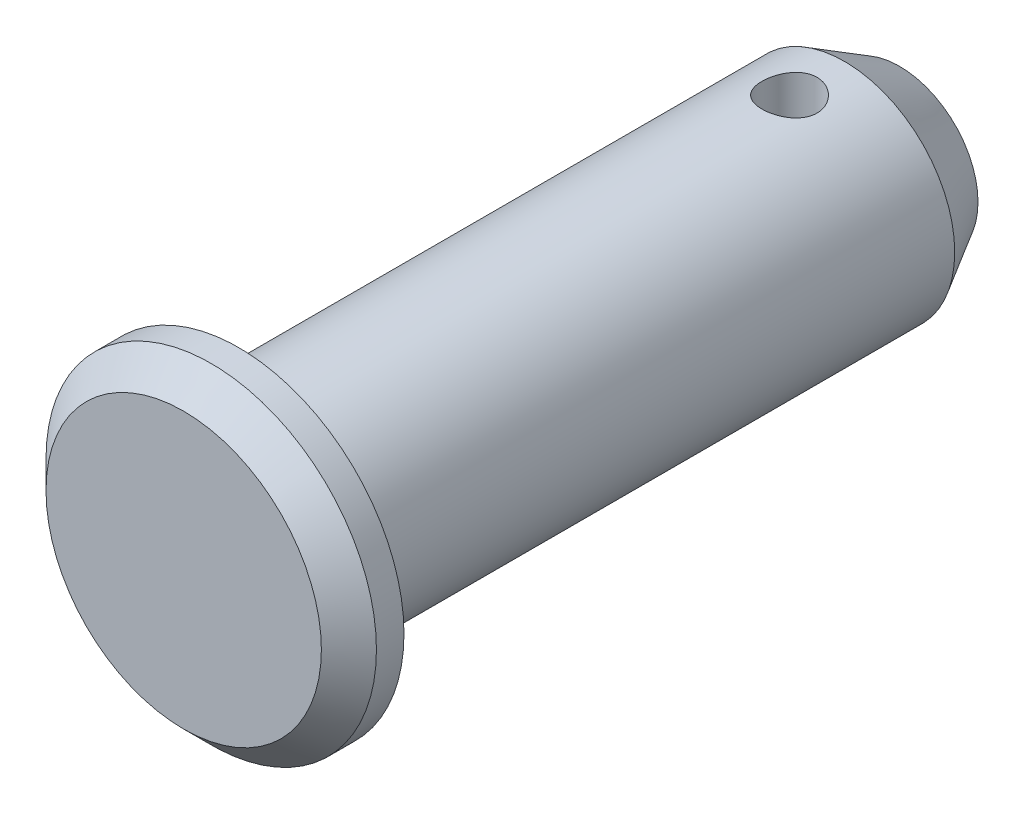
ISO-10303-21;
HEADER;
FILE_DESCRIPTION(('STEP AP214'),'2;1');
FILE_NAME('part.step','',(''),(''),'','','');
FILE_SCHEMA(('AUTOMOTIVE_DESIGN { 1 0 10303 214 1 1 1 1 }'));
ENDSEC;
DATA;
#1=APPLICATION_CONTEXT('core data for automotive mechanical design processes');
#2=APPLICATION_PROTOCOL_DEFINITION('international standard','automotive_design',2000,#1);
#3=PRODUCT_CONTEXT('',#1,'mechanical');
#4=PRODUCT('Part','Part','',(#3));
#5=PRODUCT_RELATED_PRODUCT_CATEGORY('part','',(#4));
#6=PRODUCT_DEFINITION_FORMATION('','',#4);
#7=PRODUCT_DEFINITION_CONTEXT('part definition',#1,'design');
#8=PRODUCT_DEFINITION('design','',#6,#7);
#9=PRODUCT_DEFINITION_SHAPE('','',#8);
#10=(LENGTH_UNIT() NAMED_UNIT(*) SI_UNIT(.MILLI.,.METRE.));
#11=(NAMED_UNIT(*) PLANE_ANGLE_UNIT() SI_UNIT($,.RADIAN.));
#12=(NAMED_UNIT(*) SI_UNIT($,.STERADIAN.) SOLID_ANGLE_UNIT());
#13=UNCERTAINTY_MEASURE_WITH_UNIT(LENGTH_MEASURE(1.E-05),#10,'distance_accuracy_value','');
#14=(GEOMETRIC_REPRESENTATION_CONTEXT(3) GLOBAL_UNCERTAINTY_ASSIGNED_CONTEXT((#13)) GLOBAL_UNIT_ASSIGNED_CONTEXT((#10,
#11,#12)) REPRESENTATION_CONTEXT('',''));
#15=CARTESIAN_POINT('',(0.,0.,0.));
#16=DIRECTION('',(0.,0.,1.));
#17=DIRECTION('',(1.,0.,0.));
#18=AXIS2_PLACEMENT_3D('',#15,#16,#17);
#19=CARTESIAN_POINT('',(0.,0.,6.5));
#20=DIRECTION('',(0.,0.,-1.));
#21=DIRECTION('',(-1.,0.,0.));
#22=AXIS2_PLACEMENT_3D('',#19,#20,#21);
#23=PLANE('',#22);
#24=CARTESIAN_POINT('',(0.,0.,6.5));
#25=DIRECTION('',(0.,0.,1.));
#26=DIRECTION('',(1.,0.,0.));
#27=AXIS2_PLACEMENT_3D('',#24,#25,#26);
#28=CIRCLE('',#27,2.5);
#29=CARTESIAN_POINT('',(2.5,0.,6.5));
#30=VERTEX_POINT('',#29);
#31=EDGE_CURVE('E10',#30,#30,#28,.T.);
#32=ORIENTED_EDGE('',*,*,#31,.T.);
#33=EDGE_LOOP('',(#32));
#34=FACE_BOUND('',#33,.T.);
#35=ADVANCED_FACE('F33',(#34),#23,.F.);
#36=CARTESIAN_POINT('',(0.,0.,6.));
#37=DIRECTION('',(0.,0.,-1.));
#38=DIRECTION('',(-1.,0.,0.));
#39=AXIS2_PLACEMENT_3D('',#36,#37,#38);
#40=CONICAL_SURFACE('',#39,3.,0.785398163397448);
#41=ORIENTED_EDGE('',*,*,#31,.F.);
#42=EDGE_LOOP('',(#41));
#43=FACE_BOUND('',#42,.T.);
#44=CARTESIAN_POINT('',(0.,0.,6.));
#45=DIRECTION('',(0.,0.,1.));
#46=DIRECTION('',(1.,0.,0.));
#47=AXIS2_PLACEMENT_3D('',#44,#45,#46);
#48=CIRCLE('',#47,3.);
#49=CARTESIAN_POINT('',(3.,0.,6.));
#50=VERTEX_POINT('',#49);
#51=EDGE_CURVE('E45',#50,#50,#48,.T.);
#52=ORIENTED_EDGE('',*,*,#51,.T.);
#53=EDGE_LOOP('',(#52));
#54=FACE_BOUND('',#53,.T.);
#55=ADVANCED_FACE('F82',(#43,#54),#40,.T.);
#56=CARTESIAN_POINT('',(0.,0.,6.5));
#57=DIRECTION('',(0.,0.,1.));
#58=DIRECTION('',(1.,0.,0.));
#59=AXIS2_PLACEMENT_3D('',#56,#57,#58);
#60=CYLINDRICAL_SURFACE('',#59,3.);
#61=ORIENTED_EDGE('',*,*,#51,.F.);
#62=EDGE_LOOP('',(#61));
#63=FACE_BOUND('',#62,.T.);
#64=CARTESIAN_POINT('',(0.,0.,5.5));
#65=DIRECTION('',(0.,0.,1.));
#66=DIRECTION('',(1.,0.,0.));
#67=AXIS2_PLACEMENT_3D('',#64,#65,#66);
#68=CIRCLE('',#67,3.);
#69=CARTESIAN_POINT('',(3.,0.,5.5));
#70=VERTEX_POINT('',#69);
#71=EDGE_CURVE('E50',#70,#70,#68,.T.);
#72=ORIENTED_EDGE('',*,*,#71,.T.);
#73=EDGE_LOOP('',(#72));
#74=FACE_BOUND('',#73,.T.);
#75=ADVANCED_FACE('F86',(#63,#74),#60,.T.);
#76=CARTESIAN_POINT('',(0.,0.,5.5));
#77=DIRECTION('',(0.,0.,1.));
#78=DIRECTION('',(1.,0.,0.));
#79=AXIS2_PLACEMENT_3D('',#76,#77,#78);
#80=PLANE('',#79);
#81=ORIENTED_EDGE('',*,*,#71,.F.);
#82=EDGE_LOOP('',(#81));
#83=FACE_BOUND('',#82,.T.);
#84=CARTESIAN_POINT('',(0.,0.,5.5));
#85=DIRECTION('',(0.,0.,1.));
#86=DIRECTION('',(1.,0.,0.));
#87=AXIS2_PLACEMENT_3D('',#84,#85,#86);
#88=CIRCLE('',#87,2.);
#89=CARTESIAN_POINT('',(2.,0.,5.5));
#90=VERTEX_POINT('',#89);
#91=EDGE_CURVE('E103',#90,#90,#88,.T.);
#92=ORIENTED_EDGE('',*,*,#91,.T.);
#93=EDGE_LOOP('',(#92));
#94=FACE_BOUND('',#93,.T.);
#95=ADVANCED_FACE('F77',(#83,#94),#80,.F.);
#96=CARTESIAN_POINT('',(0.,0.,6.5));
#97=DIRECTION('',(0.,0.,1.));
#98=DIRECTION('',(1.,0.,0.));
#99=AXIS2_PLACEMENT_3D('',#96,#97,#98);
#100=CYLINDRICAL_SURFACE('',#99,2.);
#101=CARTESIAN_POINT('',(0.,-2.,-4.));
#102=CARTESIAN_POINT('',(0.0276253628899103,-1.99999953289338,-4.00000077524605));
#103=CARTESIAN_POINT('',(0.0552593859435877,-1.99942192710609,-4.00229718359126));
#104=CARTESIAN_POINT('',(0.109735441256844,-1.99717371276631,-4.011408383769));
#105=CARTESIAN_POINT('',(0.13657701562358,-1.99550248473323,-4.01822573651262));
#106=CARTESIAN_POINT('',(0.188673624060859,-1.99125208777347,-4.0361464178207));
#107=CARTESIAN_POINT('',(0.213930521143334,-1.98867400947362,-4.04724459957176));
#108=CARTESIAN_POINT('',(0.262224043968142,-1.98288447935864,-4.07339379668161));
#109=CARTESIAN_POINT('',(0.28526059478292,-1.97967300618017,-4.08844494537298));
#110=CARTESIAN_POINT('',(0.328933975766973,-1.97289137863934,-4.12240026321807));
#111=CARTESIAN_POINT('',(0.349518563353691,-1.96931569049511,-4.14137052498639));
#112=CARTESIAN_POINT('',(0.387249642401101,-1.96224540039177,-4.18248406830297));
#113=CARTESIAN_POINT('',(0.404395745649711,-1.95875080762783,-4.20462770764883));
#114=CARTESIAN_POINT('',(0.435008847599677,-1.9521825856657,-4.25186507557915));
#115=CARTESIAN_POINT('',(0.448417405308452,-1.94911598156868,-4.27699774360347));
#116=CARTESIAN_POINT('',(0.470798969516843,-1.94383164937408,-4.32924947055279));
#117=CARTESIAN_POINT('',(0.479772685146444,-1.94161378557596,-4.35636821110859));
#118=CARTESIAN_POINT('',(0.492851612268097,-1.93833492239184,-4.41124783273416));
#119=CARTESIAN_POINT('',(0.497050756111113,-1.93725163691809,-4.43898496534993));
#120=CARTESIAN_POINT('',(0.500753925022618,-1.9362978751258,-4.49478952300466));
#121=CARTESIAN_POINT('',(0.500258713939326,-1.93642720149548,-4.5228568935662));
#122=CARTESIAN_POINT('',(0.49466217487976,-1.93786401832206,-4.57780526924816));
#123=CARTESIAN_POINT('',(0.489672780063507,-1.93914287667293,-4.60469854048837));
#124=CARTESIAN_POINT('',(0.475408062301036,-1.94268903225495,-4.6572536836371));
#125=CARTESIAN_POINT('',(0.466132434023141,-1.94495639990232,-4.68291546767633));
#126=CARTESIAN_POINT('',(0.443463159312385,-1.95025037968062,-4.73257933875069));
#127=CARTESIAN_POINT('',(0.430028889077637,-1.95328442489807,-4.75656205726318));
#128=CARTESIAN_POINT('',(0.399452092004985,-1.95976570282129,-4.80197290325228));
#129=CARTESIAN_POINT('',(0.382308916269613,-1.96321300778245,-4.82340058268909));
#130=CARTESIAN_POINT('',(0.344221141560406,-1.9702529351326,-4.8637345385648));
#131=CARTESIAN_POINT('',(0.323182086055287,-1.97384689825991,-4.88255149668712));
#132=CARTESIAN_POINT('',(0.278203972501233,-1.98068655192929,-4.9164070808213));
#133=CARTESIAN_POINT('',(0.254264825902648,-1.98393223183138,-4.93144559142119));
#134=CARTESIAN_POINT('',(0.204038629560463,-1.98972577364728,-4.95735019540813));
#135=CARTESIAN_POINT('',(0.177743797736207,-1.99227120042575,-4.96820178008481));
#136=CARTESIAN_POINT('',(0.123625336047627,-1.99635972330473,-4.98530576856986));
#137=CARTESIAN_POINT('',(0.095801999716828,-1.99790301113094,-4.99155905213938));
#138=CARTESIAN_POINT('',(0.0401799901300087,-1.99978499757125,-4.99915252185295));
#139=CARTESIAN_POINT('',(0.0123989066627363,-2.00015351169426,-5.0006143420251));
#140=CARTESIAN_POINT('',(-0.0430109582671695,-1.9997293493815,-4.99891699931484));
#141=CARTESIAN_POINT('',(-0.0706397532148651,-1.99893677747282,-4.99575825240029));
#142=CARTESIAN_POINT('',(-0.124538089592164,-1.99629860375786,-4.98500969720287));
#143=CARTESIAN_POINT('',(-0.150821706322918,-1.99446878061937,-4.97748624550767));
#144=CARTESIAN_POINT('',(-0.201752430817504,-1.98996235544711,-4.95829763865719));
#145=CARTESIAN_POINT('',(-0.226399373010878,-1.98728566789964,-4.94663206522894));
#146=CARTESIAN_POINT('',(-0.273841044809949,-1.98131102642104,-4.91925462370842));
#147=CARTESIAN_POINT('',(-0.29659514727861,-1.97800289122311,-4.90347462920108));
#148=CARTESIAN_POINT('',(-0.339175537881082,-1.97114836395806,-4.86840336373434));
#149=CARTESIAN_POINT('',(-0.359001319657669,-1.96760193083902,-4.84911148679436));
#150=CARTESIAN_POINT('',(-0.39566352269091,-1.96056318986924,-4.80699934638518));
#151=CARTESIAN_POINT('',(-0.412414622540677,-1.95707434729094,-4.78410409899919));
#152=CARTESIAN_POINT('',(-0.441836919670899,-1.95064292792413,-4.73575578851143));
#153=CARTESIAN_POINT('',(-0.454508298052646,-1.94770032689009,-4.71030283901342));
#154=CARTESIAN_POINT('',(-0.475317140203097,-1.94272698244889,-4.65769809252897));
#155=CARTESIAN_POINT('',(-0.483481465551355,-1.94069085097302,-4.63055745721866));
#156=CARTESIAN_POINT('',(-0.495115219984593,-1.93775581363395,-4.57523012070363));
#157=CARTESIAN_POINT('',(-0.498585675826219,-1.93685665906646,-4.54704364965584));
#158=CARTESIAN_POINT('',(-0.500679530111331,-1.93631633734652,-4.49129299204827));
#159=CARTESIAN_POINT('',(-0.499439299260039,-1.93663977576088,-4.46373418829176));
#160=CARTESIAN_POINT('',(-0.492459092770956,-1.93842636335948,-4.40923203711067));
#161=CARTESIAN_POINT('',(-0.486719207562256,-1.93988948963952,-4.38228867732878));
#162=CARTESIAN_POINT('',(-0.470977106480931,-1.94377086894241,-4.32993051364486));
#163=CARTESIAN_POINT('',(-0.461000468226792,-1.94618338412103,-4.30450756491993));
#164=CARTESIAN_POINT('',(-0.437088304535023,-1.95169251908276,-4.2556782057621));
#165=CARTESIAN_POINT('',(-0.423152230011396,-1.95478923373591,-4.23227207560436));
#166=CARTESIAN_POINT('',(-0.391289249545712,-1.96141878087837,-4.18748179033266));
#167=CARTESIAN_POINT('',(-0.373267720970751,-1.96496088277252,-4.16616630885868));
#168=CARTESIAN_POINT('',(-0.333929790396578,-1.97202675748762,-4.12681765173486));
#169=CARTESIAN_POINT('',(-0.312612607087048,-1.97555052575687,-4.10878525662901));
#170=CARTESIAN_POINT('',(-0.266822528900863,-1.98225885215888,-4.07619623047846));
#171=CARTESIAN_POINT('',(-0.242299474105462,-1.98543611121956,-4.06170846210947));
#172=CARTESIAN_POINT('',(-0.191088686503491,-1.99101641658373,-4.03708417901982));
#173=CARTESIAN_POINT('',(-0.164402521145579,-1.9934200173326,-4.02694454645049));
#174=CARTESIAN_POINT('',(-0.114803417747823,-1.99682686521847,-4.01280938989012));
#175=CARTESIAN_POINT('',(-0.0921267236360225,-1.9980086168423,-4.00801625231552));
#176=CARTESIAN_POINT('',(-0.0463020238454276,-1.99959535077316,-4.00161135212602));
#177=CARTESIAN_POINT('',(-0.0231540537475387,-2.00000039150298,-3.99999935023157));
#178=CARTESIAN_POINT('',(0.,-2.,-4.));
#179=B_SPLINE_CURVE_WITH_KNOTS('',3,(#101,#102,#103,#104,#105,#106,#107,#108,#109,#110,#111,
#112,#113,#114,#115,#116,#117,#118,#119,#120,#121,#122,#123,#124,#125,#126,#127,#128,#129,#130,
#131,#132,#133,#134,#135,#136,#137,#138,#139,#140,#141,#142,#143,#144,#145,#146,#147,#148,#149,
#150,#151,#152,#153,#154,#155,#156,#157,#158,#159,#160,#161,#162,#163,#164,#165,#166,#167,#168,
#169,#170,#171,#172,#173,#174,#175,#176,#177,#178),.UNSPECIFIED.,.T.,.F.,(4,2,2,2,2,2,2,2,2,2,2,
2,2,2,2,2,2,2,2,2,2,2,2,2,2,2,2,2,2,2,2,2,2,2,2,2,2,2,4),(0.,0.0827912374906298,
0.165629412587967,0.248368300762035,0.331109980056443,0.41538145145713,0.499662431933539,
0.585195491819357,0.670714870564562,0.754520983664769,0.838313460375657,0.920074990023394,
1.00184234488679,1.08443509291293,1.16704230278721,1.25200500323006,1.33697029852749,
1.42222743003038,1.50746824562881,1.59052769649759,1.67357967037581,1.75540091504679,
1.83723042440763,1.92051195855117,2.0038078766934,2.08914836401492,2.17448506249836,
2.25930751538012,2.34411141084136,2.42647926799538,2.50884546985345,2.59072133519816,
2.67260856045634,2.75663192136637,2.84067523256806,2.92624061833196,3.01174454607117,
3.08114080980716,3.1505318534768),.UNSPECIFIED.);
#180=CARTESIAN_POINT('',(0.,-2.,-4.));
#181=VERTEX_POINT('',#180);
#182=EDGE_CURVE('E36',#181,#181,#179,.T.);
#183=ORIENTED_EDGE('',*,*,#182,.T.);
#184=EDGE_LOOP('',(#183));
#185=FACE_BOUND('',#184,.T.);
#186=CARTESIAN_POINT('',(0.,2.,-4.));
#187=CARTESIAN_POINT('',(-0.0276253628899103,1.99999953289338,-4.00000077524605));
#188=CARTESIAN_POINT('',(-0.0552593859435876,1.99942192710609,-4.00229718359126));
#189=CARTESIAN_POINT('',(-0.109735441256844,1.99717371276631,-4.011408383769));
#190=CARTESIAN_POINT('',(-0.13657701562358,1.99550248473323,-4.01822573651262));
#191=CARTESIAN_POINT('',(-0.188673624060859,1.99125208777347,-4.0361464178207));
#192=CARTESIAN_POINT('',(-0.213930521143334,1.98867400947362,-4.04724459957176));
#193=CARTESIAN_POINT('',(-0.262224043968142,1.98288447935864,-4.07339379668161));
#194=CARTESIAN_POINT('',(-0.28526059478292,1.97967300618017,-4.08844494537298));
#195=CARTESIAN_POINT('',(-0.328933975766973,1.97289137863934,-4.12240026321807));
#196=CARTESIAN_POINT('',(-0.349518563353691,1.96931569049511,-4.14137052498639));
#197=CARTESIAN_POINT('',(-0.387249642401101,1.96224540039177,-4.18248406830297));
#198=CARTESIAN_POINT('',(-0.404395745649712,1.95875080762783,-4.20462770764883));
#199=CARTESIAN_POINT('',(-0.435008847599678,1.9521825856657,-4.25186507557915));
#200=CARTESIAN_POINT('',(-0.448417405308452,1.94911598156868,-4.27699774360347));
#201=CARTESIAN_POINT('',(-0.470798969516843,1.94383164937408,-4.32924947055279));
#202=CARTESIAN_POINT('',(-0.479772685146444,1.94161378557596,-4.35636821110859));
#203=CARTESIAN_POINT('',(-0.492851612268097,1.93833492239184,-4.41124783273416));
#204=CARTESIAN_POINT('',(-0.497050756111113,1.93725163691809,-4.43898496534993));
#205=CARTESIAN_POINT('',(-0.500753925022618,1.9362978751258,-4.49478952300466));
#206=CARTESIAN_POINT('',(-0.500258713939326,1.93642720149548,-4.5228568935662));
#207=CARTESIAN_POINT('',(-0.49466217487976,1.93786401832206,-4.57780526924816));
#208=CARTESIAN_POINT('',(-0.489672780063507,1.93914287667293,-4.60469854048837));
#209=CARTESIAN_POINT('',(-0.475408062301036,1.94268903225495,-4.6572536836371));
#210=CARTESIAN_POINT('',(-0.466132434023141,1.94495639990232,-4.68291546767633));
#211=CARTESIAN_POINT('',(-0.443463159312385,1.95025037968062,-4.73257933875069));
#212=CARTESIAN_POINT('',(-0.430028889077637,1.95328442489807,-4.75656205726319));
#213=CARTESIAN_POINT('',(-0.399452092004984,1.95976570282129,-4.80197290325228));
#214=CARTESIAN_POINT('',(-0.382308916269613,1.96321300778245,-4.82340058268909));
#215=CARTESIAN_POINT('',(-0.344221141560406,1.9702529351326,-4.8637345385648));
#216=CARTESIAN_POINT('',(-0.323182086055286,1.97384689825991,-4.88255149668712));
#217=CARTESIAN_POINT('',(-0.278203972501233,1.98068655192929,-4.9164070808213));
#218=CARTESIAN_POINT('',(-0.254264825902648,1.98393223183139,-4.93144559142119));
#219=CARTESIAN_POINT('',(-0.204038629560463,1.98972577364728,-4.95735019540813));
#220=CARTESIAN_POINT('',(-0.177743797736207,1.99227120042575,-4.96820178008481));
#221=CARTESIAN_POINT('',(-0.123625336047627,1.99635972330473,-4.98530576856986));
#222=CARTESIAN_POINT('',(-0.0958019997168279,1.99790301113094,-4.99155905213938));
#223=CARTESIAN_POINT('',(-0.0401799901300086,1.99978499757125,-4.99915252185295));
#224=CARTESIAN_POINT('',(-0.0123989066627363,2.00015351169426,-5.0006143420251));
#225=CARTESIAN_POINT('',(0.0430109582671696,1.9997293493815,-4.99891699931484));
#226=CARTESIAN_POINT('',(0.0706397532148653,1.99893677747282,-4.99575825240029));
#227=CARTESIAN_POINT('',(0.124538089592164,1.99629860375786,-4.98500969720287));
#228=CARTESIAN_POINT('',(0.150821706322918,1.99446878061937,-4.97748624550767));
#229=CARTESIAN_POINT('',(0.201752430817504,1.98996235544711,-4.95829763865719));
#230=CARTESIAN_POINT('',(0.226399373010878,1.98728566789964,-4.94663206522894));
#231=CARTESIAN_POINT('',(0.273841044809949,1.98131102642104,-4.91925462370842));
#232=CARTESIAN_POINT('',(0.29659514727861,1.97800289122311,-4.90347462920108));
#233=CARTESIAN_POINT('',(0.339175537881082,1.97114836395806,-4.86840336373434));
#234=CARTESIAN_POINT('',(0.359001319657669,1.96760193083902,-4.84911148679436));
#235=CARTESIAN_POINT('',(0.395663522690911,1.96056318986924,-4.80699934638518));
#236=CARTESIAN_POINT('',(0.412414622540678,1.95707434729094,-4.78410409899919));
#237=CARTESIAN_POINT('',(0.441836919670899,1.95064292792413,-4.73575578851143));
#238=CARTESIAN_POINT('',(0.454508298052646,1.94770032689009,-4.71030283901342));
#239=CARTESIAN_POINT('',(0.475317140203098,1.94272698244888,-4.65769809252897));
#240=CARTESIAN_POINT('',(0.483481465551355,1.94069085097302,-4.63055745721866));
#241=CARTESIAN_POINT('',(0.495115219984593,1.93775581363395,-4.57523012070363));
#242=CARTESIAN_POINT('',(0.498585675826219,1.93685665906645,-4.54704364965584));
#243=CARTESIAN_POINT('',(0.500679530111331,1.93631633734652,-4.49129299204827));
#244=CARTESIAN_POINT('',(0.499439299260039,1.93663977576088,-4.46373418829176));
#245=CARTESIAN_POINT('',(0.492459092770956,1.93842636335948,-4.40923203711067));
#246=CARTESIAN_POINT('',(0.486719207562256,1.93988948963952,-4.38228867732878));
#247=CARTESIAN_POINT('',(0.470977106480931,1.94377086894241,-4.32993051364486));
#248=CARTESIAN_POINT('',(0.461000468226792,1.94618338412103,-4.30450756491993));
#249=CARTESIAN_POINT('',(0.437088304535023,1.95169251908276,-4.2556782057621));
#250=CARTESIAN_POINT('',(0.423152230011396,1.95478923373591,-4.23227207560436));
#251=CARTESIAN_POINT('',(0.391289249545712,1.96141878087837,-4.18748179033266));
#252=CARTESIAN_POINT('',(0.373267720970751,1.96496088277252,-4.16616630885868));
#253=CARTESIAN_POINT('',(0.333929790396578,1.97202675748762,-4.12681765173486));
#254=CARTESIAN_POINT('',(0.312612607087048,1.97555052575687,-4.10878525662901));
#255=CARTESIAN_POINT('',(0.266822528900863,1.98225885215888,-4.07619623047846));
#256=CARTESIAN_POINT('',(0.242299474105462,1.98543611121956,-4.06170846210947));
#257=CARTESIAN_POINT('',(0.191088686503492,1.99101641658373,-4.03708417901982));
#258=CARTESIAN_POINT('',(0.164402521145579,1.99342001733261,-4.02694454645049));
#259=CARTESIAN_POINT('',(0.114803417747823,1.99682686521847,-4.01280938989012));
#260=CARTESIAN_POINT('',(0.0921267236360222,1.9980086168423,-4.00801625231552));
#261=CARTESIAN_POINT('',(0.0463020238454273,1.99959535077316,-4.00161135212602));
#262=CARTESIAN_POINT('',(0.0231540537475386,2.00000039150298,-3.99999935023157));
#263=CARTESIAN_POINT('',(0.,2.,-4.));
#264=B_SPLINE_CURVE_WITH_KNOTS('',3,(#186,#187,#188,#189,#190,#191,#192,#193,#194,#195,#196,
#197,#198,#199,#200,#201,#202,#203,#204,#205,#206,#207,#208,#209,#210,#211,#212,#213,#214,#215,
#216,#217,#218,#219,#220,#221,#222,#223,#224,#225,#226,#227,#228,#229,#230,#231,#232,#233,#234,
#235,#236,#237,#238,#239,#240,#241,#242,#243,#244,#245,#246,#247,#248,#249,#250,#251,#252,#253,
#254,#255,#256,#257,#258,#259,#260,#261,#262,#263),.UNSPECIFIED.,.T.,.F.,(4,2,2,2,2,2,2,2,2,2,2,
2,2,2,2,2,2,2,2,2,2,2,2,2,2,2,2,2,2,2,2,2,2,2,2,2,2,2,4),(0.,0.0827912374906298,
0.165629412587967,0.248368300762035,0.331109980056443,0.41538145145713,0.49966243193354,
0.585195491819357,0.670714870564562,0.754520983664769,0.838313460375657,0.920074990023394,
1.0018423448868,1.08443509291293,1.16704230278721,1.25200500323006,1.33697029852749,
1.42222743003038,1.50746824562881,1.59052769649759,1.67357967037581,1.75540091504679,
1.83723042440763,1.92051195855117,2.0038078766934,2.08914836401492,2.17448506249836,
2.25930751538012,2.34411141084136,2.42647926799538,2.50884546985345,2.59072133519816,
2.67260856045634,2.75663192136637,2.84067523256806,2.92624061833196,3.01174454607117,
3.08114080980716,3.1505318534768),.UNSPECIFIED.);
#265=CARTESIAN_POINT('',(0.,2.,-4.));
#266=VERTEX_POINT('',#265);
#267=EDGE_CURVE('E53',#266,#266,#264,.T.);
#268=ORIENTED_EDGE('',*,*,#267,.T.);
#269=EDGE_LOOP('',(#268));
#270=FACE_BOUND('',#269,.T.);
#271=ORIENTED_EDGE('',*,*,#91,.F.);
#272=EDGE_LOOP('',(#271));
#273=FACE_BOUND('',#272,.T.);
#274=CARTESIAN_POINT('',(0.,0.,-5.5));
#275=DIRECTION('',(0.,0.,1.));
#276=DIRECTION('',(1.,0.,0.));
#277=AXIS2_PLACEMENT_3D('',#274,#275,#276);
#278=CIRCLE('',#277,2.);
#279=CARTESIAN_POINT('',(2.,0.,-5.5));
#280=VERTEX_POINT('',#279);
#281=EDGE_CURVE('E105',#280,#280,#278,.T.);
#282=ORIENTED_EDGE('',*,*,#281,.T.);
#283=EDGE_LOOP('',(#282));
#284=FACE_BOUND('',#283,.T.);
#285=ADVANCED_FACE('F58',(#185,#270,#273,#284),#100,.T.);
#286=CARTESIAN_POINT('',(0.,0.,-6.5));
#287=DIRECTION('',(0.,0.,1.));
#288=DIRECTION('',(1.,0.,0.));
#289=AXIS2_PLACEMENT_3D('',#286,#287,#288);
#290=CONICAL_SURFACE('',#289,1.42264973081038,0.523598775598298);
#291=ORIENTED_EDGE('',*,*,#281,.F.);
#292=EDGE_LOOP('',(#291));
#293=FACE_BOUND('',#292,.T.);
#294=CARTESIAN_POINT('',(0.,0.,-6.5));
#295=DIRECTION('',(0.,0.,1.));
#296=DIRECTION('',(1.,0.,0.));
#297=AXIS2_PLACEMENT_3D('',#294,#295,#296);
#298=CIRCLE('',#297,1.42264973081038);
#299=CARTESIAN_POINT('',(1.42264973081037,0.,-6.5));
#300=VERTEX_POINT('',#299);
#301=EDGE_CURVE('E108',#300,#300,#298,.T.);
#302=ORIENTED_EDGE('',*,*,#301,.T.);
#303=EDGE_LOOP('',(#302));
#304=FACE_BOUND('',#303,.T.);
#305=ADVANCED_FACE('F70',(#293,#304),#290,.T.);
#306=CARTESIAN_POINT('',(0.,0.,-6.5));
#307=DIRECTION('',(0.,0.,1.));
#308=DIRECTION('',(1.,0.,0.));
#309=AXIS2_PLACEMENT_3D('',#306,#307,#308);
#310=PLANE('',#309);
#311=ORIENTED_EDGE('',*,*,#301,.F.);
#312=EDGE_LOOP('',(#311));
#313=FACE_BOUND('',#312,.T.);
#314=ADVANCED_FACE('F66',(#313),#310,.F.);
#315=CARTESIAN_POINT('',(0.,-3.,-4.5));
#316=DIRECTION('',(0.,1.,0.));
#317=DIRECTION('',(0.,0.,1.));
#318=AXIS2_PLACEMENT_3D('',#315,#316,#317);
#319=CYLINDRICAL_SURFACE('',#318,0.5);
#320=ORIENTED_EDGE('',*,*,#267,.F.);
#321=EDGE_LOOP('',(#320));
#322=FACE_BOUND('',#321,.T.);
#323=ORIENTED_EDGE('',*,*,#182,.F.);
#324=EDGE_LOOP('',(#323));
#325=FACE_BOUND('',#324,.T.);
#326=ADVANCED_FACE('F62',(#322,#325),#319,.F.);
#327=CLOSED_SHELL('',(#35,#55,#75,#95,#285,#305,#314,#326));
#328=MANIFOLD_SOLID_BREP('B2',#327);
#329=ADVANCED_BREP_SHAPE_REPRESENTATION('',(#18,#328),#14);
#330=SHAPE_DEFINITION_REPRESENTATION(#9,#329);
ENDSEC;
END-ISO-10303-21;
